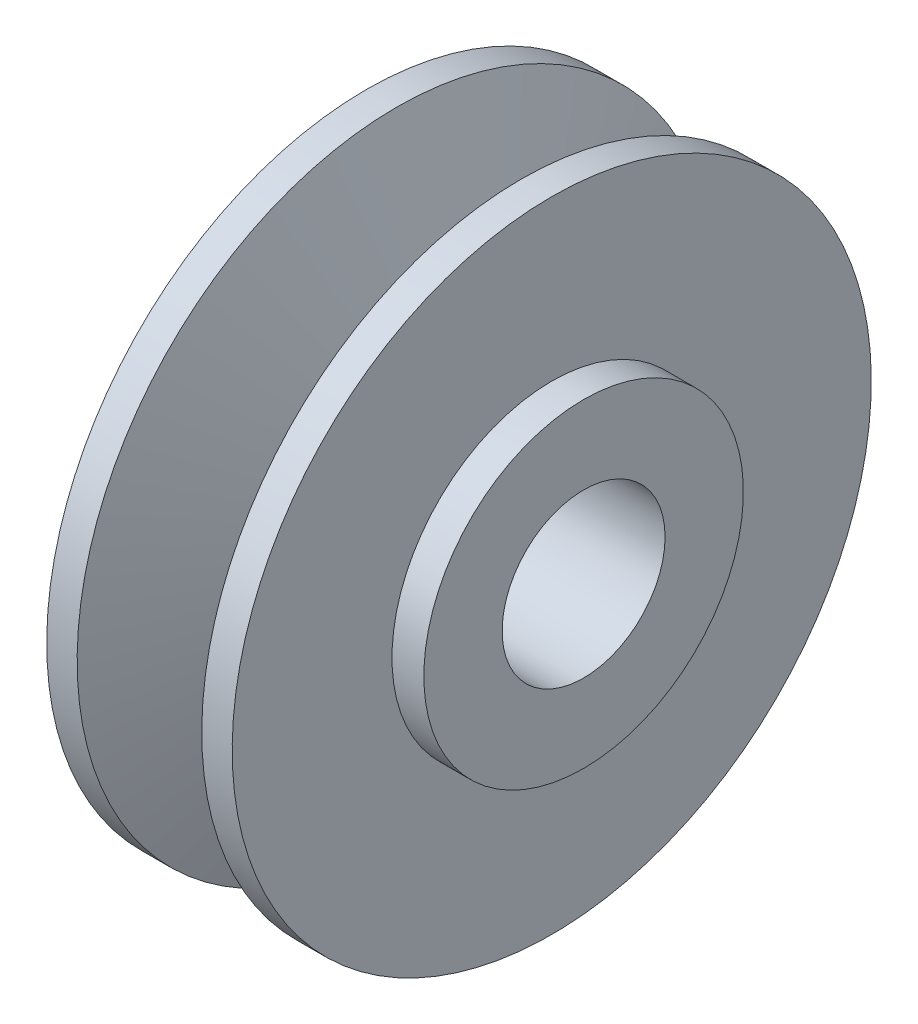
ISO-10303-21;
HEADER;
FILE_DESCRIPTION(('STEP AP214'),'2;1');
FILE_NAME('part.step','',(''),(''),'','','');
FILE_SCHEMA(('AUTOMOTIVE_DESIGN { 1 0 10303 214 1 1 1 1 }'));
ENDSEC;
DATA;
#1=APPLICATION_CONTEXT('core data for automotive mechanical design processes');
#2=APPLICATION_PROTOCOL_DEFINITION('international standard','automotive_design',2000,#1);
#3=PRODUCT_CONTEXT('',#1,'mechanical');
#4=PRODUCT('Part','Part','',(#3));
#5=PRODUCT_RELATED_PRODUCT_CATEGORY('part','',(#4));
#6=PRODUCT_DEFINITION_FORMATION('','',#4);
#7=PRODUCT_DEFINITION_CONTEXT('part definition',#1,'design');
#8=PRODUCT_DEFINITION('design','',#6,#7);
#9=PRODUCT_DEFINITION_SHAPE('','',#8);
#10=(LENGTH_UNIT() NAMED_UNIT(*) SI_UNIT(.MILLI.,.METRE.));
#11=(NAMED_UNIT(*) PLANE_ANGLE_UNIT() SI_UNIT($,.RADIAN.));
#12=(NAMED_UNIT(*) SI_UNIT($,.STERADIAN.) SOLID_ANGLE_UNIT());
#13=UNCERTAINTY_MEASURE_WITH_UNIT(LENGTH_MEASURE(1.E-05),#10,'distance_accuracy_value','');
#14=(GEOMETRIC_REPRESENTATION_CONTEXT(3) GLOBAL_UNCERTAINTY_ASSIGNED_CONTEXT((#13)) GLOBAL_UNIT_ASSIGNED_CONTEXT((#10,
#11,#12)) REPRESENTATION_CONTEXT('',''));
#15=CARTESIAN_POINT('',(0.,0.,0.));
#16=DIRECTION('',(0.,0.,1.));
#17=DIRECTION('',(1.,0.,0.));
#18=AXIS2_PLACEMENT_3D('',#15,#16,#17);
#19=CARTESIAN_POINT('',(22.675,8.334375,0.));
#20=DIRECTION('',(1.,0.,0.));
#21=DIRECTION('',(0.,1.,0.));
#22=AXIS2_PLACEMENT_3D('',#19,#20,#21);
#23=PLANE('',#22);
#24=CARTESIAN_POINT('',(22.675,0.,0.));
#25=DIRECTION('',(-1.,0.,0.));
#26=DIRECTION('',(0.,0.,1.));
#27=AXIS2_PLACEMENT_3D('',#24,#25,#26);
#28=CIRCLE('',#27,8.5);
#29=CARTESIAN_POINT('',(22.675,0.,-8.5));
#30=VERTEX_POINT('',#29);
#31=EDGE_CURVE('E71',#30,#30,#28,.T.);
#32=ORIENTED_EDGE('',*,*,#31,.T.);
#33=EDGE_LOOP('',(#32));
#34=FACE_BOUND('',#33,.T.);
#35=CARTESIAN_POINT('',(22.675,0.,0.));
#36=DIRECTION('',(1.,0.,0.));
#37=DIRECTION('',(0.,1.,0.));
#38=AXIS2_PLACEMENT_3D('',#35,#36,#37);
#39=CIRCLE('',#38,16.66875);
#40=CARTESIAN_POINT('',(22.675,16.66875,0.));
#41=VERTEX_POINT('',#40);
#42=EDGE_CURVE('E11',#41,#41,#39,.T.);
#43=ORIENTED_EDGE('',*,*,#42,.T.);
#44=EDGE_LOOP('',(#43));
#45=FACE_BOUND('',#44,.T.);
#46=ADVANCED_FACE('F16',(#34,#45),#23,.T.);
#47=CARTESIAN_POINT('',(21.0125,0.,0.));
#48=DIRECTION('',(1.,0.,0.));
#49=DIRECTION('',(0.,1.,0.));
#50=AXIS2_PLACEMENT_3D('',#47,#48,#49);
#51=CYLINDRICAL_SURFACE('',#50,16.66875);
#52=CARTESIAN_POINT('',(19.35,0.,0.));
#53=DIRECTION('',(1.,0.,0.));
#54=DIRECTION('',(0.,1.,0.));
#55=AXIS2_PLACEMENT_3D('',#52,#53,#54);
#56=CIRCLE('',#55,16.66875);
#57=CARTESIAN_POINT('',(19.35,16.66875,0.));
#58=VERTEX_POINT('',#57);
#59=EDGE_CURVE('E112',#58,#58,#56,.T.);
#60=ORIENTED_EDGE('',*,*,#59,.T.);
#61=EDGE_LOOP('',(#60));
#62=FACE_BOUND('',#61,.T.);
#63=ORIENTED_EDGE('',*,*,#42,.F.);
#64=EDGE_LOOP('',(#63));
#65=FACE_BOUND('',#64,.T.);
#66=ADVANCED_FACE('F175',(#62,#65),#51,.T.);
#67=CARTESIAN_POINT('',(17.7625,0.,0.));
#68=DIRECTION('',(1.,0.,0.));
#69=DIRECTION('',(0.,1.,0.));
#70=AXIS2_PLACEMENT_3D('',#67,#68,#69);
#71=CYLINDRICAL_SURFACE('',#70,33.3375);
#72=CARTESIAN_POINT('',(16.175,0.,0.));
#73=DIRECTION('',(1.,0.,0.));
#74=DIRECTION('',(0.,1.,0.));
#75=AXIS2_PLACEMENT_3D('',#72,#73,#74);
#76=CIRCLE('',#75,33.3375);
#77=CARTESIAN_POINT('',(16.175,33.3375,0.));
#78=VERTEX_POINT('',#77);
#79=EDGE_CURVE('E27',#78,#78,#76,.T.);
#80=ORIENTED_EDGE('',*,*,#79,.T.);
#81=EDGE_LOOP('',(#80));
#82=FACE_BOUND('',#81,.T.);
#83=CARTESIAN_POINT('',(19.35,0.,0.));
#84=DIRECTION('',(1.,0.,0.));
#85=DIRECTION('',(0.,1.,0.));
#86=AXIS2_PLACEMENT_3D('',#83,#84,#85);
#87=CIRCLE('',#86,33.3375);
#88=CARTESIAN_POINT('',(19.35,33.3375,0.));
#89=VERTEX_POINT('',#88);
#90=EDGE_CURVE('E58',#89,#89,#87,.T.);
#91=ORIENTED_EDGE('',*,*,#90,.F.);
#92=EDGE_LOOP('',(#91));
#93=FACE_BOUND('',#92,.T.);
#94=ADVANCED_FACE('F180',(#82,#93),#71,.T.);
#95=CARTESIAN_POINT('',(13.71875,0.,0.));
#96=DIRECTION('',(1.,0.,0.));
#97=DIRECTION('',(0.,1.,0.));
#98=AXIS2_PLACEMENT_3D('',#95,#96,#97);
#99=CONICAL_SURFACE('',#98,26.5890085884646,1.221730475);
#100=CARTESIAN_POINT('',(11.2625,0.,0.));
#101=DIRECTION('',(1.,0.,0.));
#102=DIRECTION('',(0.,1.,0.));
#103=AXIS2_PLACEMENT_3D('',#100,#101,#102);
#104=CIRCLE('',#103,19.8405171769292);
#105=CARTESIAN_POINT('',(11.2625,19.8405171769292,0.));
#106=VERTEX_POINT('',#105);
#107=EDGE_CURVE('E99',#106,#106,#104,.T.);
#108=ORIENTED_EDGE('',*,*,#107,.T.);
#109=EDGE_LOOP('',(#108));
#110=FACE_BOUND('',#109,.T.);
#111=ORIENTED_EDGE('',*,*,#79,.F.);
#112=EDGE_LOOP('',(#111));
#113=FACE_BOUND('',#112,.T.);
#114=ADVANCED_FACE('F18',(#110,#113),#99,.T.);
#115=CARTESIAN_POINT('',(9.675,0.,0.));
#116=DIRECTION('',(1.,0.,0.));
#117=DIRECTION('',(0.,1.,0.));
#118=AXIS2_PLACEMENT_3D('',#115,#116,#117);
#119=CYLINDRICAL_SURFACE('',#118,19.8405171769292);
#120=CARTESIAN_POINT('',(8.0875,0.,0.));
#121=DIRECTION('',(1.,0.,0.));
#122=DIRECTION('',(0.,1.,0.));
#123=AXIS2_PLACEMENT_3D('',#120,#121,#122);
#124=CIRCLE('',#123,19.8405171769292);
#125=CARTESIAN_POINT('',(8.0875,19.8405171769292,0.));
#126=VERTEX_POINT('',#125);
#127=EDGE_CURVE('E91',#126,#126,#124,.T.);
#128=ORIENTED_EDGE('',*,*,#127,.T.);
#129=EDGE_LOOP('',(#128));
#130=FACE_BOUND('',#129,.T.);
#131=ORIENTED_EDGE('',*,*,#107,.F.);
#132=EDGE_LOOP('',(#131));
#133=FACE_BOUND('',#132,.T.);
#134=ADVANCED_FACE('F182',(#130,#133),#119,.T.);
#135=CARTESIAN_POINT('',(5.63125,0.,0.));
#136=DIRECTION('',(-1.,0.,0.));
#137=DIRECTION('',(0.,1.,0.));
#138=AXIS2_PLACEMENT_3D('',#135,#136,#137);
#139=CONICAL_SURFACE('',#138,26.5890085884646,1.221730475);
#140=CARTESIAN_POINT('',(3.175,0.,0.));
#141=DIRECTION('',(1.,0.,0.));
#142=DIRECTION('',(0.,1.,0.));
#143=AXIS2_PLACEMENT_3D('',#140,#141,#142);
#144=CIRCLE('',#143,33.3375);
#145=CARTESIAN_POINT('',(3.175,33.3375,0.));
#146=VERTEX_POINT('',#145);
#147=EDGE_CURVE('E86',#146,#146,#144,.T.);
#148=ORIENTED_EDGE('',*,*,#147,.T.);
#149=EDGE_LOOP('',(#148));
#150=FACE_BOUND('',#149,.T.);
#151=ORIENTED_EDGE('',*,*,#127,.F.);
#152=EDGE_LOOP('',(#151));
#153=FACE_BOUND('',#152,.T.);
#154=ADVANCED_FACE('F170',(#150,#153),#139,.T.);
#155=CARTESIAN_POINT('',(1.5875,0.,0.));
#156=DIRECTION('',(1.,0.,0.));
#157=DIRECTION('',(0.,1.,0.));
#158=AXIS2_PLACEMENT_3D('',#155,#156,#157);
#159=CYLINDRICAL_SURFACE('',#158,33.3375);
#160=CARTESIAN_POINT('',(0.,0.,0.));
#161=DIRECTION('',(1.,0.,0.));
#162=DIRECTION('',(0.,1.,0.));
#163=AXIS2_PLACEMENT_3D('',#160,#161,#162);
#164=CIRCLE('',#163,33.3375);
#165=CARTESIAN_POINT('',(0.,33.3375,0.));
#166=VERTEX_POINT('',#165);
#167=EDGE_CURVE('E20',#166,#166,#164,.T.);
#168=ORIENTED_EDGE('',*,*,#167,.T.);
#169=EDGE_LOOP('',(#168));
#170=FACE_BOUND('',#169,.T.);
#171=ORIENTED_EDGE('',*,*,#147,.F.);
#172=EDGE_LOOP('',(#171));
#173=FACE_BOUND('',#172,.T.);
#174=ADVANCED_FACE('F161',(#170,#173),#159,.T.);
#175=CARTESIAN_POINT('',(0.,16.66875,0.));
#176=DIRECTION('',(-1.,0.,0.));
#177=DIRECTION('',(0.,0.,1.));
#178=AXIS2_PLACEMENT_3D('',#175,#176,#177);
#179=PLANE('',#178);
#180=CARTESIAN_POINT('',(0.,0.,0.));
#181=DIRECTION('',(1.,0.,0.));
#182=DIRECTION('',(0.,0.,1.));
#183=AXIS2_PLACEMENT_3D('',#180,#181,#182);
#184=CIRCLE('',#183,17.4625);
#185=CARTESIAN_POINT('',(0.,0.,17.4625));
#186=VERTEX_POINT('',#185);
#187=EDGE_CURVE('E130',#186,#186,#184,.T.);
#188=ORIENTED_EDGE('',*,*,#187,.T.);
#189=EDGE_LOOP('',(#188));
#190=FACE_BOUND('',#189,.T.);
#191=ORIENTED_EDGE('',*,*,#167,.F.);
#192=EDGE_LOOP('',(#191));
#193=FACE_BOUND('',#192,.T.);
#194=ADVANCED_FACE('F157',(#190,#193),#179,.T.);
#195=CARTESIAN_POINT('',(19.35,8.334375,0.));
#196=DIRECTION('',(1.,0.,0.));
#197=DIRECTION('',(0.,1.,0.));
#198=AXIS2_PLACEMENT_3D('',#195,#196,#197);
#199=PLANE('',#198);
#200=ORIENTED_EDGE('',*,*,#59,.F.);
#201=EDGE_LOOP('',(#200));
#202=FACE_BOUND('',#201,.T.);
#203=ORIENTED_EDGE('',*,*,#90,.T.);
#204=EDGE_LOOP('',(#203));
#205=FACE_BOUND('',#204,.T.);
#206=ADVANCED_FACE('F160',(#202,#205),#199,.T.);
#207=CARTESIAN_POINT('',(96.9807551785405,0.,0.));
#208=DIRECTION('',(-1.,0.,0.));
#209=DIRECTION('',(0.,0.,1.));
#210=AXIS2_PLACEMENT_3D('',#207,#208,#209);
#211=CYLINDRICAL_SURFACE('',#210,8.5);
#212=CARTESIAN_POINT('',(3.175,0.,0.));
#213=DIRECTION('',(-1.,0.,0.));
#214=DIRECTION('',(0.,0.,1.));
#215=AXIS2_PLACEMENT_3D('',#212,#213,#214);
#216=CIRCLE('',#215,8.5);
#217=CARTESIAN_POINT('',(3.175,0.,-8.5));
#218=VERTEX_POINT('',#217);
#219=EDGE_CURVE('E134',#218,#218,#216,.T.);
#220=ORIENTED_EDGE('',*,*,#219,.T.);
#221=EDGE_LOOP('',(#220));
#222=FACE_BOUND('',#221,.T.);
#223=ORIENTED_EDGE('',*,*,#31,.F.);
#224=EDGE_LOOP('',(#223));
#225=FACE_BOUND('',#224,.T.);
#226=ADVANCED_FACE('F153',(#222,#225),#211,.F.);
#227=CARTESIAN_POINT('',(1.5875,0.,0.));
#228=DIRECTION('',(-1.,0.,0.));
#229=DIRECTION('',(0.,0.,1.));
#230=AXIS2_PLACEMENT_3D('',#227,#228,#229);
#231=CYLINDRICAL_SURFACE('',#230,17.4625);
#232=CARTESIAN_POINT('',(3.175,0.,0.));
#233=DIRECTION('',(-1.,0.,0.));
#234=DIRECTION('',(0.,0.,1.));
#235=AXIS2_PLACEMENT_3D('',#232,#233,#234);
#236=CIRCLE('',#235,17.4625);
#237=CARTESIAN_POINT('',(3.175,0.,17.4625));
#238=VERTEX_POINT('',#237);
#239=EDGE_CURVE('E137',#238,#238,#236,.T.);
#240=ORIENTED_EDGE('',*,*,#239,.F.);
#241=EDGE_LOOP('',(#240));
#242=FACE_BOUND('',#241,.T.);
#243=ORIENTED_EDGE('',*,*,#187,.F.);
#244=EDGE_LOOP('',(#243));
#245=FACE_BOUND('',#244,.T.);
#246=ADVANCED_FACE('F150',(#242,#245),#231,.F.);
#247=CARTESIAN_POINT('',(3.175,0.,0.));
#248=DIRECTION('',(-1.,0.,0.));
#249=DIRECTION('',(0.,0.,1.));
#250=AXIS2_PLACEMENT_3D('',#247,#248,#249);
#251=PLANE('',#250);
#252=ORIENTED_EDGE('',*,*,#219,.F.);
#253=EDGE_LOOP('',(#252));
#254=FACE_BOUND('',#253,.T.);
#255=ORIENTED_EDGE('',*,*,#239,.T.);
#256=EDGE_LOOP('',(#255));
#257=FACE_BOUND('',#256,.T.);
#258=ADVANCED_FACE('F148',(#254,#257),#251,.T.);
#259=CLOSED_SHELL('',(#46,#66,#94,#114,#134,#154,#174,#194,#206,#226,#246,#258));
#260=MANIFOLD_SOLID_BREP('B1',#259);
#261=ADVANCED_BREP_SHAPE_REPRESENTATION('',(#18,#260),#14);
#262=SHAPE_DEFINITION_REPRESENTATION(#9,#261);
ENDSEC;
END-ISO-10303-21;
